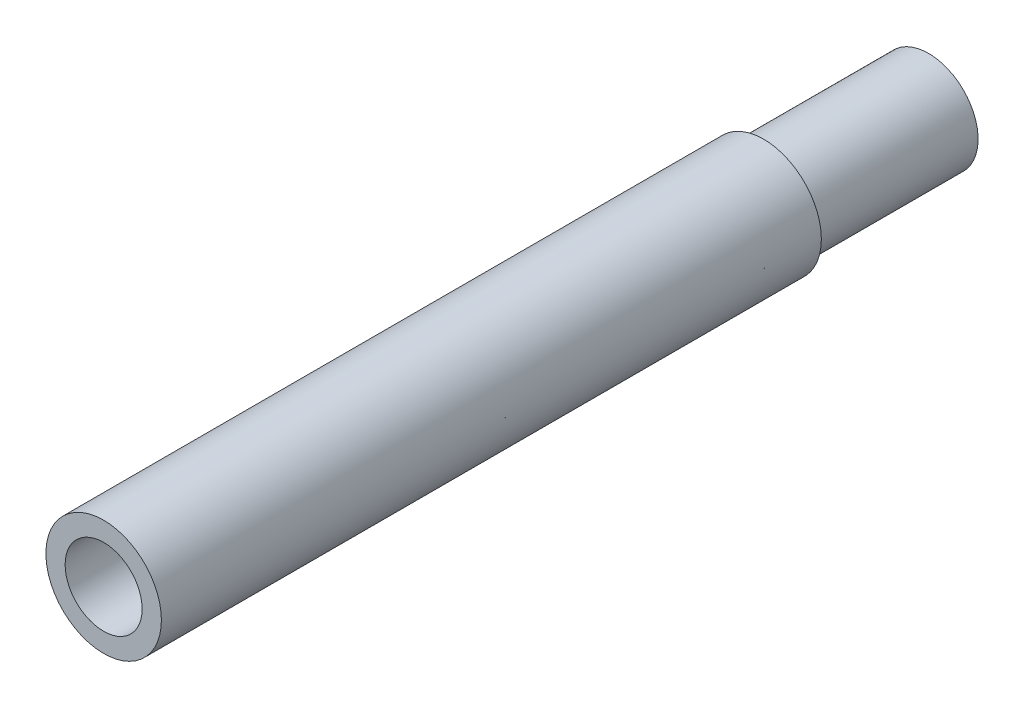
ISO-10303-21;
HEADER;
FILE_DESCRIPTION(('STEP AP214'),'2;1');
FILE_NAME('part.step','',(''),(''),'','','');
FILE_SCHEMA(('AUTOMOTIVE_DESIGN { 1 0 10303 214 1 1 1 1 }'));
ENDSEC;
DATA;
#1=APPLICATION_CONTEXT('core data for automotive mechanical design processes');
#2=APPLICATION_PROTOCOL_DEFINITION('international standard','automotive_design',2000,#1);
#3=PRODUCT_CONTEXT('',#1,'mechanical');
#4=PRODUCT('Part','Part','',(#3));
#5=PRODUCT_RELATED_PRODUCT_CATEGORY('part','',(#4));
#6=PRODUCT_DEFINITION_FORMATION('','',#4);
#7=PRODUCT_DEFINITION_CONTEXT('part definition',#1,'design');
#8=PRODUCT_DEFINITION('design','',#6,#7);
#9=PRODUCT_DEFINITION_SHAPE('','',#8);
#10=(LENGTH_UNIT() NAMED_UNIT(*) SI_UNIT(.MILLI.,.METRE.));
#11=(NAMED_UNIT(*) PLANE_ANGLE_UNIT() SI_UNIT($,.RADIAN.));
#12=(NAMED_UNIT(*) SI_UNIT($,.STERADIAN.) SOLID_ANGLE_UNIT());
#13=UNCERTAINTY_MEASURE_WITH_UNIT(LENGTH_MEASURE(1.E-05),#10,'distance_accuracy_value','');
#14=(GEOMETRIC_REPRESENTATION_CONTEXT(3) GLOBAL_UNCERTAINTY_ASSIGNED_CONTEXT((#13)) GLOBAL_UNIT_ASSIGNED_CONTEXT((#10,
#11,#12)) REPRESENTATION_CONTEXT('',''));
#15=CARTESIAN_POINT('',(0.,0.,0.));
#16=DIRECTION('',(0.,0.,1.));
#17=DIRECTION('',(1.,0.,0.));
#18=AXIS2_PLACEMENT_3D('',#15,#16,#17);
#19=CARTESIAN_POINT('',(0.,0.,120.));
#20=DIRECTION('',(0.,0.,1.));
#21=DIRECTION('',(1.,0.,0.));
#22=AXIS2_PLACEMENT_3D('',#19,#20,#21);
#23=PLANE('',#22);
#24=CARTESIAN_POINT('',(0.,0.,120.));
#25=DIRECTION('',(0.,0.,1.));
#26=DIRECTION('',(1.,0.,0.));
#27=AXIS2_PLACEMENT_3D('',#24,#25,#26);
#28=CIRCLE('',#27,10.5);
#29=CARTESIAN_POINT('',(10.5,0.,120.));
#30=VERTEX_POINT('',#29);
#31=EDGE_CURVE('E42',#30,#30,#28,.T.);
#32=ORIENTED_EDGE('',*,*,#31,.T.);
#33=EDGE_LOOP('',(#32));
#34=FACE_BOUND('',#33,.T.);
#35=CARTESIAN_POINT('',(0.,0.,120.));
#36=DIRECTION('',(0.,0.,1.));
#37=DIRECTION('',(1.,0.,0.));
#38=AXIS2_PLACEMENT_3D('',#35,#36,#37);
#39=CIRCLE('',#38,7.);
#40=CARTESIAN_POINT('',(7.,0.,120.));
#41=VERTEX_POINT('',#40);
#42=EDGE_CURVE('E52',#41,#41,#39,.T.);
#43=ORIENTED_EDGE('',*,*,#42,.F.);
#44=EDGE_LOOP('',(#43));
#45=FACE_BOUND('',#44,.T.);
#46=ADVANCED_FACE('F38',(#34,#45),#23,.T.);
#47=CARTESIAN_POINT('',(0.,0.,0.));
#48=DIRECTION('',(0.,0.,1.));
#49=DIRECTION('',(1.,0.,0.));
#50=AXIS2_PLACEMENT_3D('',#47,#48,#49);
#51=PLANE('',#50);
#52=CARTESIAN_POINT('',(0.,0.,0.));
#53=DIRECTION('',(0.,0.,-1.));
#54=DIRECTION('',(-1.,0.,0.));
#55=AXIS2_PLACEMENT_3D('',#52,#53,#54);
#56=CIRCLE('',#55,9.);
#57=CARTESIAN_POINT('',(-9.,0.,0.));
#58=VERTEX_POINT('',#57);
#59=EDGE_CURVE('E10',#58,#58,#56,.T.);
#60=ORIENTED_EDGE('',*,*,#59,.F.);
#61=EDGE_LOOP('',(#60));
#62=FACE_BOUND('',#61,.T.);
#63=CARTESIAN_POINT('',(0.,0.,0.));
#64=DIRECTION('',(0.,0.,1.));
#65=DIRECTION('',(1.,0.,0.));
#66=AXIS2_PLACEMENT_3D('',#63,#64,#65);
#67=CIRCLE('',#66,10.5);
#68=CARTESIAN_POINT('',(10.5,0.,0.));
#69=VERTEX_POINT('',#68);
#70=EDGE_CURVE('E37',#69,#69,#67,.T.);
#71=ORIENTED_EDGE('',*,*,#70,.F.);
#72=EDGE_LOOP('',(#71));
#73=FACE_BOUND('',#72,.T.);
#74=ADVANCED_FACE('F76',(#62,#73),#51,.F.);
#75=CARTESIAN_POINT('',(0.,0.,120.));
#76=DIRECTION('',(0.,0.,-1.));
#77=DIRECTION('',(-1.,0.,0.));
#78=AXIS2_PLACEMENT_3D('',#75,#76,#77);
#79=CYLINDRICAL_SURFACE('',#78,10.5);
#80=ORIENTED_EDGE('',*,*,#31,.F.);
#81=EDGE_LOOP('',(#80));
#82=FACE_BOUND('',#81,.T.);
#83=ORIENTED_EDGE('',*,*,#70,.T.);
#84=EDGE_LOOP('',(#83));
#85=FACE_BOUND('',#84,.T.);
#86=ADVANCED_FACE('F36',(#82,#85),#79,.T.);
#87=CARTESIAN_POINT('',(0.,0.,120.));
#88=DIRECTION('',(0.,0.,-1.));
#89=DIRECTION('',(-1.,0.,0.));
#90=AXIS2_PLACEMENT_3D('',#87,#88,#89);
#91=CYLINDRICAL_SURFACE('',#90,7.);
#92=ORIENTED_EDGE('',*,*,#42,.T.);
#93=EDGE_LOOP('',(#92));
#94=FACE_BOUND('',#93,.T.);
#95=CARTESIAN_POINT('',(0.,0.,-30.));
#96=DIRECTION('',(0.,0.,-1.));
#97=DIRECTION('',(-1.,0.,0.));
#98=AXIS2_PLACEMENT_3D('',#95,#96,#97);
#99=CIRCLE('',#98,7.);
#100=CARTESIAN_POINT('',(-7.,0.,-30.));
#101=VERTEX_POINT('',#100);
#102=EDGE_CURVE('E56',#101,#101,#99,.T.);
#103=ORIENTED_EDGE('',*,*,#102,.T.);
#104=EDGE_LOOP('',(#103));
#105=FACE_BOUND('',#104,.T.);
#106=ADVANCED_FACE('F64',(#94,#105),#91,.F.);
#107=CARTESIAN_POINT('',(0.,0.,-30.));
#108=DIRECTION('',(0.,0.,-1.));
#109=DIRECTION('',(-1.,0.,0.));
#110=AXIS2_PLACEMENT_3D('',#107,#108,#109);
#111=PLANE('',#110);
#112=CARTESIAN_POINT('',(0.,0.,-30.));
#113=DIRECTION('',(0.,0.,-1.));
#114=DIRECTION('',(-1.,0.,0.));
#115=AXIS2_PLACEMENT_3D('',#112,#113,#114);
#116=CIRCLE('',#115,9.);
#117=CARTESIAN_POINT('',(-9.,0.,-30.));
#118=VERTEX_POINT('',#117);
#119=EDGE_CURVE('E51',#118,#118,#116,.T.);
#120=ORIENTED_EDGE('',*,*,#119,.T.);
#121=EDGE_LOOP('',(#120));
#122=FACE_BOUND('',#121,.T.);
#123=ORIENTED_EDGE('',*,*,#102,.F.);
#124=EDGE_LOOP('',(#123));
#125=FACE_BOUND('',#124,.T.);
#126=ADVANCED_FACE('F67',(#122,#125),#111,.T.);
#127=CARTESIAN_POINT('',(0.,0.,-30.));
#128=DIRECTION('',(0.,0.,1.));
#129=DIRECTION('',(1.,0.,0.));
#130=AXIS2_PLACEMENT_3D('',#127,#128,#129);
#131=CYLINDRICAL_SURFACE('',#130,9.);
#132=ORIENTED_EDGE('',*,*,#119,.F.);
#133=EDGE_LOOP('',(#132));
#134=FACE_BOUND('',#133,.T.);
#135=ORIENTED_EDGE('',*,*,#59,.T.);
#136=EDGE_LOOP('',(#135));
#137=FACE_BOUND('',#136,.T.);
#138=ADVANCED_FACE('F68',(#134,#137),#131,.T.);
#139=CLOSED_SHELL('',(#46,#74,#86,#106,#126,#138));
#140=MANIFOLD_SOLID_BREP('B2',#139);
#141=ADVANCED_BREP_SHAPE_REPRESENTATION('',(#18,#140),#14);
#142=SHAPE_DEFINITION_REPRESENTATION(#9,#141);
ENDSEC;
END-ISO-10303-21;
